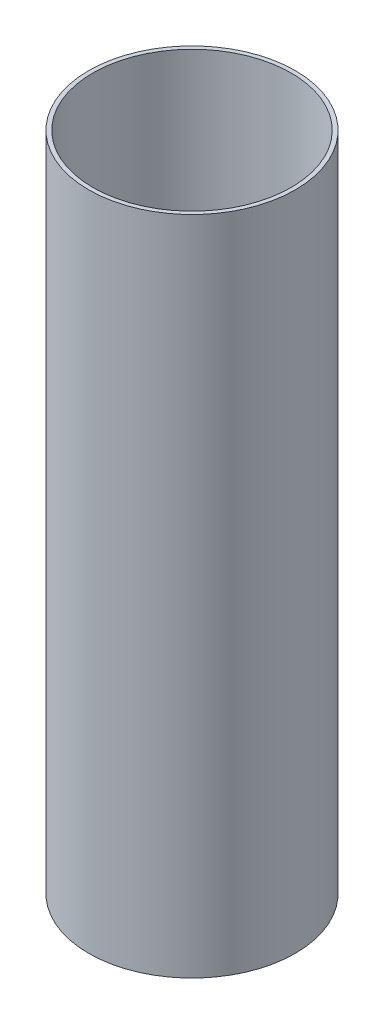
ISO-10303-21;
HEADER;
FILE_DESCRIPTION(('STEP AP214'),'2;1');
FILE_NAME('part.step','',(''),(''),'','','');
FILE_SCHEMA(('AUTOMOTIVE_DESIGN { 1 0 10303 214 1 1 1 1 }'));
ENDSEC;
DATA;
#1=APPLICATION_CONTEXT('core data for automotive mechanical design processes');
#2=APPLICATION_PROTOCOL_DEFINITION('international standard','automotive_design',2000,#1);
#3=PRODUCT_CONTEXT('',#1,'mechanical');
#4=PRODUCT('Part','Part','',(#3));
#5=PRODUCT_RELATED_PRODUCT_CATEGORY('part','',(#4));
#6=PRODUCT_DEFINITION_FORMATION('','',#4);
#7=PRODUCT_DEFINITION_CONTEXT('part definition',#1,'design');
#8=PRODUCT_DEFINITION('design','',#6,#7);
#9=PRODUCT_DEFINITION_SHAPE('','',#8);
#10=(LENGTH_UNIT() NAMED_UNIT(*) SI_UNIT(.MILLI.,.METRE.));
#11=(NAMED_UNIT(*) PLANE_ANGLE_UNIT() SI_UNIT($,.RADIAN.));
#12=(NAMED_UNIT(*) SI_UNIT($,.STERADIAN.) SOLID_ANGLE_UNIT());
#13=UNCERTAINTY_MEASURE_WITH_UNIT(LENGTH_MEASURE(1.E-05),#10,'distance_accuracy_value','');
#14=(GEOMETRIC_REPRESENTATION_CONTEXT(3) GLOBAL_UNCERTAINTY_ASSIGNED_CONTEXT((#13)) GLOBAL_UNIT_ASSIGNED_CONTEXT((#10,
#11,#12)) REPRESENTATION_CONTEXT('',''));
#15=CARTESIAN_POINT('',(0.,0.,0.));
#16=DIRECTION('',(0.,0.,1.));
#17=DIRECTION('',(1.,0.,0.));
#18=AXIS2_PLACEMENT_3D('',#15,#16,#17);
#19=CARTESIAN_POINT('',(0.,127.,0.));
#20=DIRECTION('',(0.,1.,0.));
#21=DIRECTION('',(0.,0.,1.));
#22=AXIS2_PLACEMENT_3D('',#19,#20,#21);
#23=PLANE('',#22);
#24=CARTESIAN_POINT('',(0.,127.,0.));
#25=DIRECTION('',(0.,1.,0.));
#26=DIRECTION('',(0.,0.,1.));
#27=AXIS2_PLACEMENT_3D('',#24,#25,#26);
#28=CIRCLE('',#27,39.6748);
#29=CARTESIAN_POINT('',(0.,127.,39.6748));
#30=VERTEX_POINT('',#29);
#31=EDGE_CURVE('E10',#30,#30,#28,.T.);
#32=ORIENTED_EDGE('',*,*,#31,.T.);
#33=EDGE_LOOP('',(#32));
#34=FACE_BOUND('',#33,.T.);
#35=CARTESIAN_POINT('',(0.,127.,0.));
#36=DIRECTION('',(0.,1.,0.));
#37=DIRECTION('',(0.,0.,1.));
#38=AXIS2_PLACEMENT_3D('',#35,#36,#37);
#39=CIRCLE('',#38,38.1);
#40=CARTESIAN_POINT('',(0.,127.,38.1));
#41=VERTEX_POINT('',#40);
#42=EDGE_CURVE('E50',#41,#41,#39,.T.);
#43=ORIENTED_EDGE('',*,*,#42,.F.);
#44=EDGE_LOOP('',(#43));
#45=FACE_BOUND('',#44,.T.);
#46=ADVANCED_FACE('F37',(#34,#45),#23,.T.);
#47=CARTESIAN_POINT('',(0.,-127.,0.));
#48=DIRECTION('',(0.,1.,0.));
#49=DIRECTION('',(0.,0.,1.));
#50=AXIS2_PLACEMENT_3D('',#47,#48,#49);
#51=PLANE('',#50);
#52=CARTESIAN_POINT('',(0.,-127.,0.));
#53=DIRECTION('',(0.,1.,0.));
#54=DIRECTION('',(0.,0.,1.));
#55=AXIS2_PLACEMENT_3D('',#52,#53,#54);
#56=CIRCLE('',#55,39.6748);
#57=CARTESIAN_POINT('',(0.,-127.,39.6748));
#58=VERTEX_POINT('',#57);
#59=EDGE_CURVE('E41',#58,#58,#56,.T.);
#60=ORIENTED_EDGE('',*,*,#59,.F.);
#61=EDGE_LOOP('',(#60));
#62=FACE_BOUND('',#61,.T.);
#63=CARTESIAN_POINT('',(0.,-127.,0.));
#64=DIRECTION('',(0.,1.,0.));
#65=DIRECTION('',(0.,0.,1.));
#66=AXIS2_PLACEMENT_3D('',#63,#64,#65);
#67=CIRCLE('',#66,38.1);
#68=CARTESIAN_POINT('',(0.,-127.,38.1));
#69=VERTEX_POINT('',#68);
#70=EDGE_CURVE('E52',#69,#69,#67,.T.);
#71=ORIENTED_EDGE('',*,*,#70,.T.);
#72=EDGE_LOOP('',(#71));
#73=FACE_BOUND('',#72,.T.);
#74=ADVANCED_FACE('F64',(#62,#73),#51,.F.);
#75=CARTESIAN_POINT('',(0.,127.,0.));
#76=DIRECTION('',(0.,-1.,0.));
#77=DIRECTION('',(0.,0.,-1.));
#78=AXIS2_PLACEMENT_3D('',#75,#76,#77);
#79=CYLINDRICAL_SURFACE('',#78,39.6748);
#80=ORIENTED_EDGE('',*,*,#31,.F.);
#81=EDGE_LOOP('',(#80));
#82=FACE_BOUND('',#81,.T.);
#83=ORIENTED_EDGE('',*,*,#59,.T.);
#84=EDGE_LOOP('',(#83));
#85=FACE_BOUND('',#84,.T.);
#86=ADVANCED_FACE('F39',(#82,#85),#79,.T.);
#87=CARTESIAN_POINT('',(0.,127.,0.));
#88=DIRECTION('',(0.,-1.,0.));
#89=DIRECTION('',(0.,0.,-1.));
#90=AXIS2_PLACEMENT_3D('',#87,#88,#89);
#91=CYLINDRICAL_SURFACE('',#90,38.1);
#92=ORIENTED_EDGE('',*,*,#42,.T.);
#93=EDGE_LOOP('',(#92));
#94=FACE_BOUND('',#93,.T.);
#95=ORIENTED_EDGE('',*,*,#70,.F.);
#96=EDGE_LOOP('',(#95));
#97=FACE_BOUND('',#96,.T.);
#98=ADVANCED_FACE('F60',(#94,#97),#91,.F.);
#99=CLOSED_SHELL('',(#46,#74,#86,#98));
#100=MANIFOLD_SOLID_BREP('B2',#99);
#101=ADVANCED_BREP_SHAPE_REPRESENTATION('',(#18,#100),#14);
#102=SHAPE_DEFINITION_REPRESENTATION(#9,#101);
ENDSEC;
END-ISO-10303-21;
